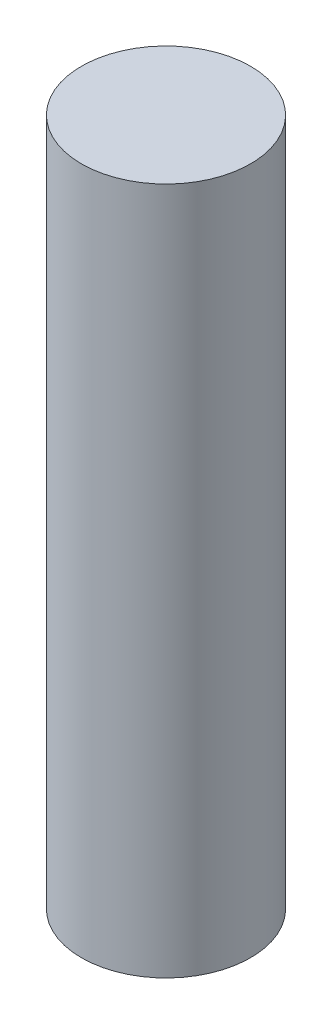
ISO-10303-21;
HEADER;
FILE_DESCRIPTION(('STEP AP214'),'2;1');
FILE_NAME('part.step','',(''),(''),'','','');
FILE_SCHEMA(('AUTOMOTIVE_DESIGN { 1 0 10303 214 1 1 1 1 }'));
ENDSEC;
DATA;
#1=APPLICATION_CONTEXT('core data for automotive mechanical design processes');
#2=APPLICATION_PROTOCOL_DEFINITION('international standard','automotive_design',2000,#1);
#3=PRODUCT_CONTEXT('',#1,'mechanical');
#4=PRODUCT('Part','Part','',(#3));
#5=PRODUCT_RELATED_PRODUCT_CATEGORY('part','',(#4));
#6=PRODUCT_DEFINITION_FORMATION('','',#4);
#7=PRODUCT_DEFINITION_CONTEXT('part definition',#1,'design');
#8=PRODUCT_DEFINITION('design','',#6,#7);
#9=PRODUCT_DEFINITION_SHAPE('','',#8);
#10=(LENGTH_UNIT() NAMED_UNIT(*) SI_UNIT(.MILLI.,.METRE.));
#11=(NAMED_UNIT(*) PLANE_ANGLE_UNIT() SI_UNIT($,.RADIAN.));
#12=(NAMED_UNIT(*) SI_UNIT($,.STERADIAN.) SOLID_ANGLE_UNIT());
#13=UNCERTAINTY_MEASURE_WITH_UNIT(LENGTH_MEASURE(1.E-05),#10,'distance_accuracy_value','');
#14=(GEOMETRIC_REPRESENTATION_CONTEXT(3) GLOBAL_UNCERTAINTY_ASSIGNED_CONTEXT((#13)) GLOBAL_UNIT_ASSIGNED_CONTEXT((#10,
#11,#12)) REPRESENTATION_CONTEXT('',''));
#15=CARTESIAN_POINT('',(0.,0.,0.));
#16=DIRECTION('',(0.,0.,1.));
#17=DIRECTION('',(1.,0.,0.));
#18=AXIS2_PLACEMENT_3D('',#15,#16,#17);
#19=CARTESIAN_POINT('',(0.,100.,0.));
#20=DIRECTION('',(0.,-1.,0.));
#21=DIRECTION('',(0.,0.,-1.));
#22=AXIS2_PLACEMENT_3D('',#19,#20,#21);
#23=CYLINDRICAL_SURFACE('',#22,12.3);
#24=CARTESIAN_POINT('',(0.,100.,0.));
#25=DIRECTION('',(0.,1.,0.));
#26=DIRECTION('',(0.,0.,1.));
#27=AXIS2_PLACEMENT_3D('',#24,#25,#26);
#28=CIRCLE('',#27,12.3);
#29=CARTESIAN_POINT('',(0.,100.,12.3));
#30=VERTEX_POINT('',#29);
#31=EDGE_CURVE('E10',#30,#30,#28,.T.);
#32=ORIENTED_EDGE('',*,*,#31,.F.);
#33=EDGE_LOOP('',(#32));
#34=FACE_BOUND('',#33,.T.);
#35=CARTESIAN_POINT('',(0.,0.,0.));
#36=DIRECTION('',(0.,1.,0.));
#37=DIRECTION('',(0.,0.,1.));
#38=AXIS2_PLACEMENT_3D('',#35,#36,#37);
#39=CIRCLE('',#38,12.3);
#40=CARTESIAN_POINT('',(0.,0.,12.3));
#41=VERTEX_POINT('',#40);
#42=EDGE_CURVE('E34',#41,#41,#39,.T.);
#43=ORIENTED_EDGE('',*,*,#42,.T.);
#44=EDGE_LOOP('',(#43));
#45=FACE_BOUND('',#44,.T.);
#46=ADVANCED_FACE('F31',(#34,#45),#23,.T.);
#47=CARTESIAN_POINT('',(0.,100.,0.));
#48=DIRECTION('',(0.,1.,0.));
#49=DIRECTION('',(0.,0.,1.));
#50=AXIS2_PLACEMENT_3D('',#47,#48,#49);
#51=PLANE('',#50);
#52=ORIENTED_EDGE('',*,*,#31,.T.);
#53=EDGE_LOOP('',(#52));
#54=FACE_BOUND('',#53,.T.);
#55=ADVANCED_FACE('F46',(#54),#51,.T.);
#56=CARTESIAN_POINT('',(0.,0.,0.));
#57=DIRECTION('',(0.,1.,0.));
#58=DIRECTION('',(0.,0.,1.));
#59=AXIS2_PLACEMENT_3D('',#56,#57,#58);
#60=PLANE('',#59);
#61=ORIENTED_EDGE('',*,*,#42,.F.);
#62=EDGE_LOOP('',(#61));
#63=FACE_BOUND('',#62,.T.);
#64=ADVANCED_FACE('F44',(#63),#60,.F.);
#65=CLOSED_SHELL('',(#46,#55,#64));
#66=MANIFOLD_SOLID_BREP('B2',#65);
#67=ADVANCED_BREP_SHAPE_REPRESENTATION('',(#18,#66),#14);
#68=SHAPE_DEFINITION_REPRESENTATION(#9,#67);
ENDSEC;
END-ISO-10303-21;
